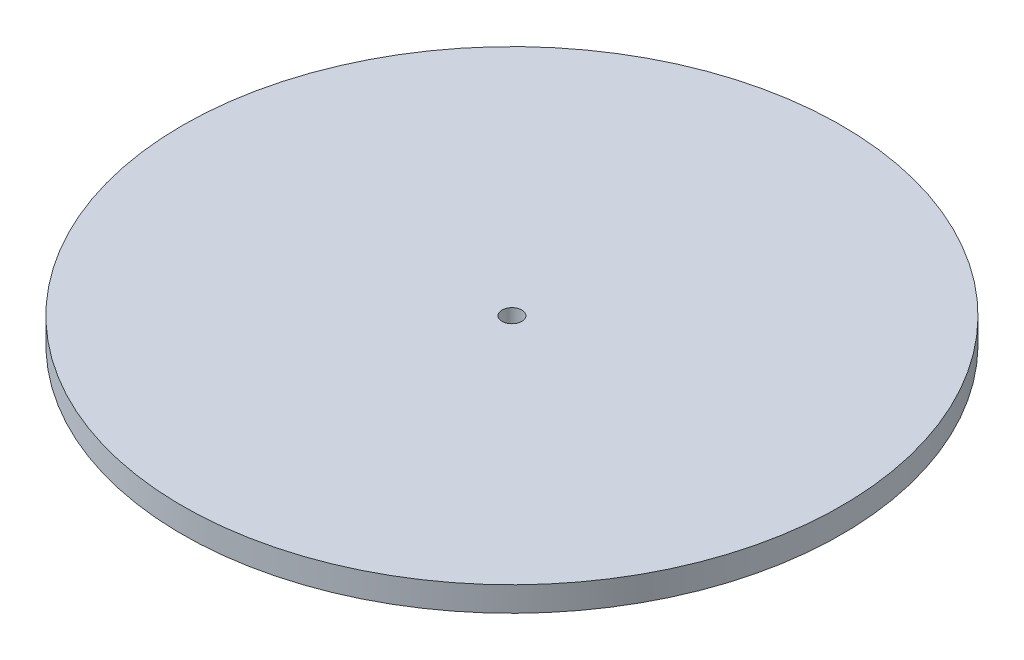
ISO-10303-21;
HEADER;
FILE_DESCRIPTION(('STEP AP214'),'2;1');
FILE_NAME('part.step','',(''),(''),'','','');
FILE_SCHEMA(('AUTOMOTIVE_DESIGN { 1 0 10303 214 1 1 1 1 }'));
ENDSEC;
DATA;
#1=APPLICATION_CONTEXT('core data for automotive mechanical design processes');
#2=APPLICATION_PROTOCOL_DEFINITION('international standard','automotive_design',2000,#1);
#3=PRODUCT_CONTEXT('',#1,'mechanical');
#4=PRODUCT('Part','Part','',(#3));
#5=PRODUCT_RELATED_PRODUCT_CATEGORY('part','',(#4));
#6=PRODUCT_DEFINITION_FORMATION('','',#4);
#7=PRODUCT_DEFINITION_CONTEXT('part definition',#1,'design');
#8=PRODUCT_DEFINITION('design','',#6,#7);
#9=PRODUCT_DEFINITION_SHAPE('','',#8);
#10=(LENGTH_UNIT() NAMED_UNIT(*) SI_UNIT(.MILLI.,.METRE.));
#11=(NAMED_UNIT(*) PLANE_ANGLE_UNIT() SI_UNIT($,.RADIAN.));
#12=(NAMED_UNIT(*) SI_UNIT($,.STERADIAN.) SOLID_ANGLE_UNIT());
#13=UNCERTAINTY_MEASURE_WITH_UNIT(LENGTH_MEASURE(1.E-05),#10,'distance_accuracy_value','');
#14=(GEOMETRIC_REPRESENTATION_CONTEXT(3) GLOBAL_UNCERTAINTY_ASSIGNED_CONTEXT((#13)) GLOBAL_UNIT_ASSIGNED_CONTEXT((#10,
#11,#12)) REPRESENTATION_CONTEXT('',''));
#15=CARTESIAN_POINT('',(0.,0.,0.));
#16=DIRECTION('',(0.,0.,1.));
#17=DIRECTION('',(1.,0.,0.));
#18=AXIS2_PLACEMENT_3D('',#15,#16,#17);
#19=CARTESIAN_POINT('',(0.,16.3257508990037,0.));
#20=DIRECTION('',(0.,1.,0.));
#21=DIRECTION('',(-1.,0.,0.));
#22=AXIS2_PLACEMENT_3D('',#19,#20,#21);
#23=CYLINDRICAL_SURFACE('',#22,40.);
#24=CARTESIAN_POINT('',(0.,16.3257508990037,0.));
#25=DIRECTION('',(0.,1.,0.));
#26=DIRECTION('',(-1.,0.,0.));
#27=AXIS2_PLACEMENT_3D('',#24,#25,#26);
#28=CIRCLE('',#27,40.);
#29=CARTESIAN_POINT('',(-40.,16.3257508990037,0.));
#30=VERTEX_POINT('',#29);
#31=EDGE_CURVE('E49',#30,#30,#28,.T.);
#32=ORIENTED_EDGE('',*,*,#31,.F.);
#33=EDGE_LOOP('',(#32));
#34=FACE_BOUND('',#33,.T.);
#35=CARTESIAN_POINT('',(0.,13.3257508990037,0.));
#36=DIRECTION('',(0.,1.,0.));
#37=DIRECTION('',(-1.,0.,0.));
#38=AXIS2_PLACEMENT_3D('',#35,#36,#37);
#39=CIRCLE('',#38,40.);
#40=CARTESIAN_POINT('',(-40.,13.3257508990037,0.));
#41=VERTEX_POINT('',#40);
#42=EDGE_CURVE('E10',#41,#41,#39,.T.);
#43=ORIENTED_EDGE('',*,*,#42,.T.);
#44=EDGE_LOOP('',(#43));
#45=FACE_BOUND('',#44,.T.);
#46=ADVANCED_FACE('F30',(#34,#45),#23,.T.);
#47=CARTESIAN_POINT('',(37.,13.3257508990037,0.));
#48=DIRECTION('',(0.,1.,0.));
#49=DIRECTION('',(-1.,0.,0.));
#50=AXIS2_PLACEMENT_3D('',#47,#48,#49);
#51=PLANE('',#50);
#52=ORIENTED_EDGE('',*,*,#42,.F.);
#53=EDGE_LOOP('',(#52));
#54=FACE_BOUND('',#53,.T.);
#55=CARTESIAN_POINT('',(0.,13.3257508990037,0.));
#56=DIRECTION('',(0.,1.,0.));
#57=DIRECTION('',(-1.,0.,0.));
#58=AXIS2_PLACEMENT_3D('',#55,#56,#57);
#59=CIRCLE('',#58,37.);
#60=CARTESIAN_POINT('',(-37.,13.3257508990037,0.));
#61=VERTEX_POINT('',#60);
#62=EDGE_CURVE('E36',#61,#61,#59,.T.);
#63=ORIENTED_EDGE('',*,*,#62,.T.);
#64=EDGE_LOOP('',(#63));
#65=FACE_BOUND('',#64,.T.);
#66=ADVANCED_FACE('F70',(#54,#65),#51,.F.);
#67=CARTESIAN_POINT('',(0.,16.3257508990037,0.));
#68=DIRECTION('',(0.,1.,0.));
#69=DIRECTION('',(-1.,0.,0.));
#70=AXIS2_PLACEMENT_3D('',#67,#68,#69);
#71=CYLINDRICAL_SURFACE('',#70,37.000000000087);
#72=ORIENTED_EDGE('',*,*,#62,.F.);
#73=EDGE_LOOP('',(#72));
#74=FACE_BOUND('',#73,.T.);
#75=CARTESIAN_POINT('',(0.,12.3257508990683,0.));
#76=DIRECTION('',(0.,1.,0.));
#77=DIRECTION('',(-1.,0.,0.));
#78=AXIS2_PLACEMENT_3D('',#75,#76,#77);
#79=CIRCLE('',#78,37.000000000174);
#80=CARTESIAN_POINT('',(-37.000000000174,12.3257508990683,0.));
#81=VERTEX_POINT('',#80);
#82=EDGE_CURVE('E40',#81,#81,#79,.T.);
#83=ORIENTED_EDGE('',*,*,#82,.T.);
#84=EDGE_LOOP('',(#83));
#85=FACE_BOUND('',#84,.T.);
#86=ADVANCED_FACE('F66',(#74,#85),#71,.T.);
#87=CARTESIAN_POINT('',(8.40852994871133E-13,0.,0.));
#88=CARTESIAN_POINT('',(4.62499998349306,-0.0149674364506071,0.));
#89=CARTESIAN_POINT('',(9.24999998052116,1.24401094022942,0.));
#90=CARTESIAN_POINT('',(13.8749999876898,3.45737981597553,0.));
#91=CARTESIAN_POINT('',(18.4999999871958,4.94956299835695,0.));
#92=CARTESIAN_POINT('',(23.1249999935488,7.0861657444294,0.));
#93=CARTESIAN_POINT('',(27.7499999952061,8.78082698987714,0.));
#94=CARTESIAN_POINT('',(32.374999998259,10.6068395722878,0.));
#95=CARTESIAN_POINT('',(37.000000000174,12.3257508990683,0.));
#96=B_SPLINE_CURVE_WITH_KNOTS('',8,(#87,#88,#89,#90,#91,#92,#93,#94,#95),.UNSPECIFIED.,.F.,.F.,
(9,9),(0.08335966161447,0.916956274811951),.UNSPECIFIED.);
#97=CARTESIAN_POINT('',(0.,16.3257508990037,0.));
#98=DIRECTION('',(0.,1.,0.));
#99=AXIS1_PLACEMENT('',#97,#98);
#100=SURFACE_OF_REVOLUTION('',#96,#99);
#101=CARTESIAN_POINT('',(0.,0.0329300220852438,0.));
#102=DIRECTION('',(0.,1.,0.));
#103=DIRECTION('',(-1.,0.,0.));
#104=AXIS2_PLACEMENT_3D('',#101,#102,#103);
#105=CIRCLE('',#104,1.2);
#106=CARTESIAN_POINT('',(-1.2,0.0329300220852438,0.));
#107=VERTEX_POINT('',#106);
#108=EDGE_CURVE('E52',#107,#107,#105,.T.);
#109=ORIENTED_EDGE('',*,*,#108,.T.);
#110=EDGE_LOOP('',(#109));
#111=FACE_BOUND('',#110,.T.);
#112=ORIENTED_EDGE('',*,*,#82,.F.);
#113=EDGE_LOOP('',(#112));
#114=FACE_BOUND('',#113,.T.);
#115=ADVANCED_FACE('F61',(#111,#114),#100,.T.);
#116=CARTESIAN_POINT('',(0.,16.3257508990037,0.));
#117=DIRECTION('',(0.,1.,0.));
#118=DIRECTION('',(-1.,0.,0.));
#119=AXIS2_PLACEMENT_3D('',#116,#117,#118);
#120=CYLINDRICAL_SURFACE('',#119,1.2);
#121=CARTESIAN_POINT('',(0.,16.3257508990037,0.));
#122=DIRECTION('',(0.,1.,0.));
#123=DIRECTION('',(-1.,0.,0.));
#124=AXIS2_PLACEMENT_3D('',#121,#122,#123);
#125=CIRCLE('',#124,1.2);
#126=CARTESIAN_POINT('',(-1.2,16.3257508990037,0.));
#127=VERTEX_POINT('',#126);
#128=EDGE_CURVE('E44',#127,#127,#125,.T.);
#129=ORIENTED_EDGE('',*,*,#128,.T.);
#130=EDGE_LOOP('',(#129));
#131=FACE_BOUND('',#130,.T.);
#132=ORIENTED_EDGE('',*,*,#108,.F.);
#133=EDGE_LOOP('',(#132));
#134=FACE_BOUND('',#133,.T.);
#135=ADVANCED_FACE('F65',(#131,#134),#120,.F.);
#136=CARTESIAN_POINT('',(40.,16.3257508990037,0.));
#137=DIRECTION('',(0.,-1.,0.));
#138=DIRECTION('',(1.,0.,0.));
#139=AXIS2_PLACEMENT_3D('',#136,#137,#138);
#140=PLANE('',#139);
#141=ORIENTED_EDGE('',*,*,#128,.F.);
#142=EDGE_LOOP('',(#141));
#143=FACE_BOUND('',#142,.T.);
#144=ORIENTED_EDGE('',*,*,#31,.T.);
#145=EDGE_LOOP('',(#144));
#146=FACE_BOUND('',#145,.T.);
#147=ADVANCED_FACE('F82',(#143,#146),#140,.F.);
#148=CLOSED_SHELL('',(#46,#66,#86,#115,#135,#147));
#149=MANIFOLD_SOLID_BREP('B2',#148);
#150=ADVANCED_BREP_SHAPE_REPRESENTATION('',(#18,#149),#14);
#151=SHAPE_DEFINITION_REPRESENTATION(#9,#150);
ENDSEC;
END-ISO-10303-21;
